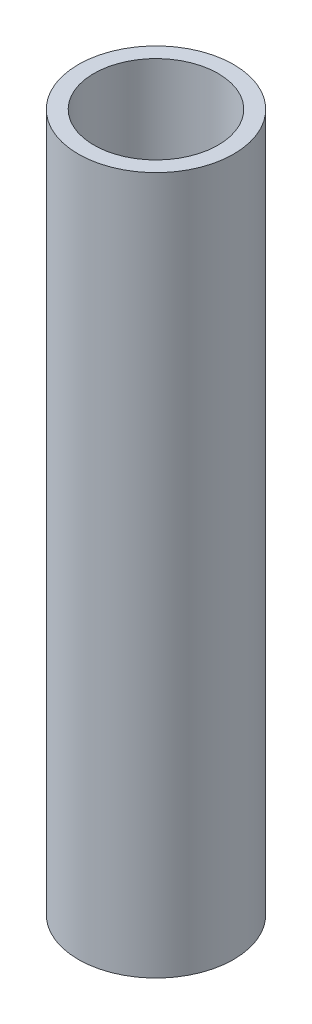
ISO-10303-21;
HEADER;
FILE_DESCRIPTION(('STEP AP214'),'2;1');
FILE_NAME('part.step','',(''),(''),'','','');
FILE_SCHEMA(('AUTOMOTIVE_DESIGN { 1 0 10303 214 1 1 1 1 }'));
ENDSEC;
DATA;
#1=APPLICATION_CONTEXT('core data for automotive mechanical design processes');
#2=APPLICATION_PROTOCOL_DEFINITION('international standard','automotive_design',2000,#1);
#3=PRODUCT_CONTEXT('',#1,'mechanical');
#4=PRODUCT('Part','Part','',(#3));
#5=PRODUCT_RELATED_PRODUCT_CATEGORY('part','',(#4));
#6=PRODUCT_DEFINITION_FORMATION('','',#4);
#7=PRODUCT_DEFINITION_CONTEXT('part definition',#1,'design');
#8=PRODUCT_DEFINITION('design','',#6,#7);
#9=PRODUCT_DEFINITION_SHAPE('','',#8);
#10=(LENGTH_UNIT() NAMED_UNIT(*) SI_UNIT(.MILLI.,.METRE.));
#11=(NAMED_UNIT(*) PLANE_ANGLE_UNIT() SI_UNIT($,.RADIAN.));
#12=(NAMED_UNIT(*) SI_UNIT($,.STERADIAN.) SOLID_ANGLE_UNIT());
#13=UNCERTAINTY_MEASURE_WITH_UNIT(LENGTH_MEASURE(1.E-05),#10,'distance_accuracy_value','');
#14=(GEOMETRIC_REPRESENTATION_CONTEXT(3) GLOBAL_UNCERTAINTY_ASSIGNED_CONTEXT((#13)) GLOBAL_UNIT_ASSIGNED_CONTEXT((#10,
#11,#12)) REPRESENTATION_CONTEXT('',''));
#15=CARTESIAN_POINT('',(0.,0.,0.));
#16=DIRECTION('',(0.,0.,1.));
#17=DIRECTION('',(1.,0.,0.));
#18=AXIS2_PLACEMENT_3D('',#15,#16,#17);
#19=CARTESIAN_POINT('',(0.,28.5242,0.));
#20=DIRECTION('',(0.,1.,0.));
#21=DIRECTION('',(0.,0.,1.));
#22=AXIS2_PLACEMENT_3D('',#19,#20,#21);
#23=PLANE('',#22);
#24=CARTESIAN_POINT('',(0.,28.5242,0.));
#25=DIRECTION('',(0.,1.,0.));
#26=DIRECTION('',(0.,0.,1.));
#27=AXIS2_PLACEMENT_3D('',#24,#25,#26);
#28=CIRCLE('',#27,3.175);
#29=CARTESIAN_POINT('',(0.,28.5242,-3.175));
#30=VERTEX_POINT('',#29);
#31=EDGE_CURVE('E10',#30,#30,#28,.T.);
#32=ORIENTED_EDGE('',*,*,#31,.T.);
#33=EDGE_LOOP('',(#32));
#34=FACE_BOUND('',#33,.T.);
#35=CARTESIAN_POINT('',(0.,28.5242,0.));
#36=DIRECTION('',(0.,1.,0.));
#37=DIRECTION('',(0.,0.,1.));
#38=AXIS2_PLACEMENT_3D('',#35,#36,#37);
#39=CIRCLE('',#38,2.54);
#40=CARTESIAN_POINT('',(0.,28.5242,-2.54));
#41=VERTEX_POINT('',#40);
#42=EDGE_CURVE('E46',#41,#41,#39,.T.);
#43=ORIENTED_EDGE('',*,*,#42,.F.);
#44=EDGE_LOOP('',(#43));
#45=FACE_BOUND('',#44,.T.);
#46=ADVANCED_FACE('F35',(#34,#45),#23,.T.);
#47=CARTESIAN_POINT('',(0.,0.,0.));
#48=DIRECTION('',(0.,1.,0.));
#49=DIRECTION('',(0.,0.,1.));
#50=AXIS2_PLACEMENT_3D('',#47,#48,#49);
#51=PLANE('',#50);
#52=CARTESIAN_POINT('',(0.,0.,0.));
#53=DIRECTION('',(0.,1.,0.));
#54=DIRECTION('',(0.,0.,1.));
#55=AXIS2_PLACEMENT_3D('',#52,#53,#54);
#56=CIRCLE('',#55,3.175);
#57=CARTESIAN_POINT('',(0.,0.,-3.175));
#58=VERTEX_POINT('',#57);
#59=EDGE_CURVE('E39',#58,#58,#56,.T.);
#60=ORIENTED_EDGE('',*,*,#59,.F.);
#61=EDGE_LOOP('',(#60));
#62=FACE_BOUND('',#61,.T.);
#63=CARTESIAN_POINT('',(0.,0.,0.));
#64=DIRECTION('',(0.,1.,0.));
#65=DIRECTION('',(0.,0.,1.));
#66=AXIS2_PLACEMENT_3D('',#63,#64,#65);
#67=CIRCLE('',#66,2.54);
#68=CARTESIAN_POINT('',(0.,0.,-2.54));
#69=VERTEX_POINT('',#68);
#70=EDGE_CURVE('E48',#69,#69,#67,.T.);
#71=ORIENTED_EDGE('',*,*,#70,.T.);
#72=EDGE_LOOP('',(#71));
#73=FACE_BOUND('',#72,.T.);
#74=ADVANCED_FACE('F58',(#62,#73),#51,.F.);
#75=CARTESIAN_POINT('',(0.,28.5242,0.));
#76=DIRECTION('',(0.,-1.,0.));
#77=DIRECTION('',(0.,0.,-1.));
#78=AXIS2_PLACEMENT_3D('',#75,#76,#77);
#79=CYLINDRICAL_SURFACE('',#78,3.175);
#80=CARTESIAN_POINT('',(0.,28.5242,-3.175));
#81=CARTESIAN_POINT('',(0.,28.2270729166667,-3.175));
#82=CARTESIAN_POINT('',(0.,27.9299458333333,-3.175));
#83=CARTESIAN_POINT('',(0.,27.3356916666667,-3.175));
#84=CARTESIAN_POINT('',(0.,27.0385645833333,-3.175));
#85=CARTESIAN_POINT('',(0.,26.4443104166667,-3.175));
#86=CARTESIAN_POINT('',(0.,26.1471833333333,-3.175));
#87=CARTESIAN_POINT('',(0.,25.5529291666667,-3.175));
#88=CARTESIAN_POINT('',(0.,25.2558020833333,-3.175));
#89=CARTESIAN_POINT('',(0.,24.6615479166667,-3.175));
#90=CARTESIAN_POINT('',(0.,24.3644208333333,-3.175));
#91=CARTESIAN_POINT('',(0.,23.7701666666667,-3.175));
#92=CARTESIAN_POINT('',(0.,23.4730395833333,-3.175));
#93=CARTESIAN_POINT('',(0.,22.8787854166667,-3.175));
#94=CARTESIAN_POINT('',(0.,22.5816583333333,-3.175));
#95=CARTESIAN_POINT('',(0.,21.9874041666667,-3.175));
#96=CARTESIAN_POINT('',(0.,21.6902770833333,-3.175));
#97=CARTESIAN_POINT('',(0.,21.0960229166667,-3.175));
#98=CARTESIAN_POINT('',(0.,20.7988958333333,-3.175));
#99=CARTESIAN_POINT('',(0.,20.2046416666667,-3.175));
#100=CARTESIAN_POINT('',(0.,19.9075145833333,-3.175));
#101=CARTESIAN_POINT('',(0.,19.3132604166667,-3.175));
#102=CARTESIAN_POINT('',(0.,19.0161333333333,-3.175));
#103=CARTESIAN_POINT('',(0.,18.4218791666667,-3.175));
#104=CARTESIAN_POINT('',(0.,18.1247520833333,-3.175));
#105=CARTESIAN_POINT('',(0.,17.5304979166667,-3.175));
#106=CARTESIAN_POINT('',(0.,17.2333708333333,-3.175));
#107=CARTESIAN_POINT('',(0.,16.6391166666667,-3.175));
#108=CARTESIAN_POINT('',(0.,16.3419895833333,-3.175));
#109=CARTESIAN_POINT('',(0.,15.7477354166667,-3.175));
#110=CARTESIAN_POINT('',(0.,15.4506083333333,-3.175));
#111=CARTESIAN_POINT('',(0.,14.8563541666667,-3.175));
#112=CARTESIAN_POINT('',(0.,14.5592270833333,-3.175));
#113=CARTESIAN_POINT('',(0.,13.9649729166667,-3.175));
#114=CARTESIAN_POINT('',(0.,13.6678458333333,-3.175));
#115=CARTESIAN_POINT('',(0.,13.0735916666667,-3.175));
#116=CARTESIAN_POINT('',(0.,12.7764645833333,-3.175));
#117=CARTESIAN_POINT('',(0.,12.1822104166667,-3.175));
#118=CARTESIAN_POINT('',(0.,11.8850833333333,-3.175));
#119=CARTESIAN_POINT('',(0.,11.2908291666667,-3.175));
#120=CARTESIAN_POINT('',(0.,10.9937020833333,-3.175));
#121=CARTESIAN_POINT('',(0.,10.3994479166667,-3.175));
#122=CARTESIAN_POINT('',(0.,10.1023208333333,-3.175));
#123=CARTESIAN_POINT('',(0.,9.50806666666667,-3.175));
#124=CARTESIAN_POINT('',(0.,9.21093958333333,-3.175));
#125=CARTESIAN_POINT('',(0.,8.61668541666667,-3.175));
#126=CARTESIAN_POINT('',(0.,8.31955833333333,-3.175));
#127=CARTESIAN_POINT('',(0.,7.72530416666667,-3.175));
#128=CARTESIAN_POINT('',(0.,7.42817708333333,-3.175));
#129=CARTESIAN_POINT('',(0.,6.83392291666666,-3.175));
#130=CARTESIAN_POINT('',(0.,6.53679583333333,-3.175));
#131=CARTESIAN_POINT('',(0.,5.94254166666666,-3.175));
#132=CARTESIAN_POINT('',(0.,5.64541458333333,-3.175));
#133=CARTESIAN_POINT('',(0.,5.05116041666666,-3.175));
#134=CARTESIAN_POINT('',(0.,4.75403333333333,-3.175));
#135=CARTESIAN_POINT('',(0.,4.15977916666666,-3.175));
#136=CARTESIAN_POINT('',(0.,3.86265208333333,-3.175));
#137=CARTESIAN_POINT('',(0.,3.26839791666666,-3.175));
#138=CARTESIAN_POINT('',(0.,2.97127083333333,-3.175));
#139=CARTESIAN_POINT('',(0.,2.37701666666666,-3.175));
#140=CARTESIAN_POINT('',(0.,2.07988958333333,-3.175));
#141=CARTESIAN_POINT('',(0.,1.48563541666666,-3.175));
#142=CARTESIAN_POINT('',(0.,1.18850833333333,-3.175));
#143=CARTESIAN_POINT('',(0.,0.594254166666663,-3.175));
#144=CARTESIAN_POINT('',(0.,0.29712708333333,-3.175));
#145=CARTESIAN_POINT('',(0.,0.,-3.175));
#146=B_SPLINE_CURVE_WITH_KNOTS('',3,(#80,#81,#82,#83,#84,#85,#86,#87,#88,#89,#90,#91,#92,#93,
#94,#95,#96,#97,#98,#99,#100,#101,#102,#103,#104,#105,#106,#107,#108,#109,#110,#111,#112,#113,
#114,#115,#116,#117,#118,#119,#120,#121,#122,#123,#124,#125,#126,#127,#128,#129,#130,#131,#132,
#133,#134,#135,#136,#137,#138,#139,#140,#141,#142,#143,#144,#145),.UNSPECIFIED.,.F.,.F.,(4,2,2,
2,2,2,2,2,2,2,2,2,2,2,2,2,2,2,2,2,2,2,2,2,2,2,2,2,2,2,2,2,4),(0.,0.891381250000003,1.7827625,
2.67414375,3.565525,4.45690625,5.3482875,6.23966875,7.13105,8.02243125,8.9138125,9.80519375,
10.696575,11.58795625,12.4793375,13.37071875,14.2621,15.15348125,16.0448625,16.93624375,
17.827625,18.71900625,19.6103875,20.50176875,21.39315,22.28453125,23.1759125,24.06729375,
24.958675,25.85005625,26.7414375,27.63281875,28.5242),.UNSPECIFIED.);
#147=EDGE_CURVE('BSEAM37',#30,#58,#146,.T.);
#148=ORIENTED_EDGE('',*,*,#31,.F.);
#149=ORIENTED_EDGE('',*,*,#59,.T.);
#150=ORIENTED_EDGE('',*,*,#147,.T.);
#151=ORIENTED_EDGE('',*,*,#147,.F.);
#152=EDGE_LOOP('',(#148,#150,#149,#151));
#153=FACE_BOUND('',#152,.T.);
#154=ADVANCED_FACE('F37',(#153),#79,.T.);
#155=CARTESIAN_POINT('',(0.,28.5242,0.));
#156=DIRECTION('',(0.,-1.,0.));
#157=DIRECTION('',(0.,0.,-1.));
#158=AXIS2_PLACEMENT_3D('',#155,#156,#157);
#159=CYLINDRICAL_SURFACE('',#158,2.54);
#160=CARTESIAN_POINT('',(0.,28.5242,-2.54));
#161=CARTESIAN_POINT('',(0.,28.2270729166667,-2.54));
#162=CARTESIAN_POINT('',(0.,27.9299458333333,-2.54));
#163=CARTESIAN_POINT('',(0.,27.3356916666667,-2.54));
#164=CARTESIAN_POINT('',(0.,27.0385645833333,-2.54));
#165=CARTESIAN_POINT('',(0.,26.4443104166667,-2.54));
#166=CARTESIAN_POINT('',(0.,26.1471833333333,-2.54));
#167=CARTESIAN_POINT('',(0.,25.5529291666667,-2.54));
#168=CARTESIAN_POINT('',(0.,25.2558020833333,-2.54));
#169=CARTESIAN_POINT('',(0.,24.6615479166667,-2.54));
#170=CARTESIAN_POINT('',(0.,24.3644208333333,-2.54));
#171=CARTESIAN_POINT('',(0.,23.7701666666667,-2.54));
#172=CARTESIAN_POINT('',(0.,23.4730395833333,-2.54));
#173=CARTESIAN_POINT('',(0.,22.8787854166667,-2.54));
#174=CARTESIAN_POINT('',(0.,22.5816583333333,-2.54));
#175=CARTESIAN_POINT('',(0.,21.9874041666667,-2.54));
#176=CARTESIAN_POINT('',(0.,21.6902770833333,-2.54));
#177=CARTESIAN_POINT('',(0.,21.0960229166667,-2.54));
#178=CARTESIAN_POINT('',(0.,20.7988958333333,-2.54));
#179=CARTESIAN_POINT('',(0.,20.2046416666667,-2.54));
#180=CARTESIAN_POINT('',(0.,19.9075145833333,-2.54));
#181=CARTESIAN_POINT('',(0.,19.3132604166667,-2.54));
#182=CARTESIAN_POINT('',(0.,19.0161333333333,-2.54));
#183=CARTESIAN_POINT('',(0.,18.4218791666667,-2.54));
#184=CARTESIAN_POINT('',(0.,18.1247520833333,-2.54));
#185=CARTESIAN_POINT('',(0.,17.5304979166667,-2.54));
#186=CARTESIAN_POINT('',(0.,17.2333708333333,-2.54));
#187=CARTESIAN_POINT('',(0.,16.6391166666667,-2.54));
#188=CARTESIAN_POINT('',(0.,16.3419895833333,-2.54));
#189=CARTESIAN_POINT('',(0.,15.7477354166667,-2.54));
#190=CARTESIAN_POINT('',(0.,15.4506083333333,-2.54));
#191=CARTESIAN_POINT('',(0.,14.8563541666667,-2.54));
#192=CARTESIAN_POINT('',(0.,14.5592270833333,-2.54));
#193=CARTESIAN_POINT('',(0.,13.9649729166667,-2.54));
#194=CARTESIAN_POINT('',(0.,13.6678458333333,-2.54));
#195=CARTESIAN_POINT('',(0.,13.0735916666667,-2.54));
#196=CARTESIAN_POINT('',(0.,12.7764645833333,-2.54));
#197=CARTESIAN_POINT('',(0.,12.1822104166667,-2.54));
#198=CARTESIAN_POINT('',(0.,11.8850833333333,-2.54));
#199=CARTESIAN_POINT('',(0.,11.2908291666667,-2.54));
#200=CARTESIAN_POINT('',(0.,10.9937020833333,-2.54));
#201=CARTESIAN_POINT('',(0.,10.3994479166667,-2.54));
#202=CARTESIAN_POINT('',(0.,10.1023208333333,-2.54));
#203=CARTESIAN_POINT('',(0.,9.50806666666666,-2.54));
#204=CARTESIAN_POINT('',(0.,9.21093958333333,-2.54));
#205=CARTESIAN_POINT('',(0.,8.61668541666666,-2.54));
#206=CARTESIAN_POINT('',(0.,8.31955833333333,-2.54));
#207=CARTESIAN_POINT('',(0.,7.72530416666666,-2.54));
#208=CARTESIAN_POINT('',(0.,7.42817708333333,-2.54));
#209=CARTESIAN_POINT('',(0.,6.83392291666666,-2.54));
#210=CARTESIAN_POINT('',(0.,6.53679583333333,-2.54));
#211=CARTESIAN_POINT('',(0.,5.94254166666666,-2.54));
#212=CARTESIAN_POINT('',(0.,5.64541458333333,-2.54));
#213=CARTESIAN_POINT('',(0.,5.05116041666666,-2.54));
#214=CARTESIAN_POINT('',(0.,4.75403333333333,-2.54));
#215=CARTESIAN_POINT('',(0.,4.15977916666666,-2.54));
#216=CARTESIAN_POINT('',(0.,3.86265208333333,-2.54));
#217=CARTESIAN_POINT('',(0.,3.26839791666666,-2.54));
#218=CARTESIAN_POINT('',(0.,2.97127083333333,-2.54));
#219=CARTESIAN_POINT('',(0.,2.37701666666666,-2.54));
#220=CARTESIAN_POINT('',(0.,2.07988958333333,-2.54));
#221=CARTESIAN_POINT('',(0.,1.48563541666666,-2.54));
#222=CARTESIAN_POINT('',(0.,1.18850833333333,-2.54));
#223=CARTESIAN_POINT('',(0.,0.594254166666663,-2.54));
#224=CARTESIAN_POINT('',(0.,0.29712708333333,-2.54));
#225=CARTESIAN_POINT('',(0.,0.,-2.54));
#226=B_SPLINE_CURVE_WITH_KNOTS('',3,(#160,#161,#162,#163,#164,#165,#166,#167,#168,#169,#170,
#171,#172,#173,#174,#175,#176,#177,#178,#179,#180,#181,#182,#183,#184,#185,#186,#187,#188,#189,
#190,#191,#192,#193,#194,#195,#196,#197,#198,#199,#200,#201,#202,#203,#204,#205,#206,#207,#208,
#209,#210,#211,#212,#213,#214,#215,#216,#217,#218,#219,#220,#221,#222,#223,#224,#225),
.UNSPECIFIED.,.F.,.F.,(4,2,2,2,2,2,2,2,2,2,2,2,2,2,2,2,2,2,2,2,2,2,2,2,2,2,2,2,2,2,2,2,4),(0.,
0.89138125,1.7827625,2.67414375,3.565525,4.45690625,5.3482875,6.23966875,7.13105,8.02243125,
8.9138125,9.80519375,10.696575,11.58795625,12.4793375,13.37071875,14.2621,15.15348125,
16.0448625,16.93624375,17.827625,18.71900625,19.6103875,20.50176875,21.39315,22.28453125,
23.1759125,24.06729375,24.958675,25.85005625,26.7414375,27.63281875,28.5242),.UNSPECIFIED.);
#227=EDGE_CURVE('BSEAM54',#41,#69,#226,.T.);
#228=ORIENTED_EDGE('',*,*,#42,.T.);
#229=ORIENTED_EDGE('',*,*,#70,.F.);
#230=ORIENTED_EDGE('',*,*,#227,.T.);
#231=ORIENTED_EDGE('',*,*,#227,.F.);
#232=EDGE_LOOP('',(#228,#230,#229,#231));
#233=FACE_BOUND('',#232,.T.);
#234=ADVANCED_FACE('F54',(#233),#159,.F.);
#235=CLOSED_SHELL('',(#46,#74,#154,#234));
#236=MANIFOLD_SOLID_BREP('B2',#235);
#237=ADVANCED_BREP_SHAPE_REPRESENTATION('',(#18,#236),#14);
#238=SHAPE_DEFINITION_REPRESENTATION(#9,#237);
ENDSEC;
END-ISO-10303-21;
